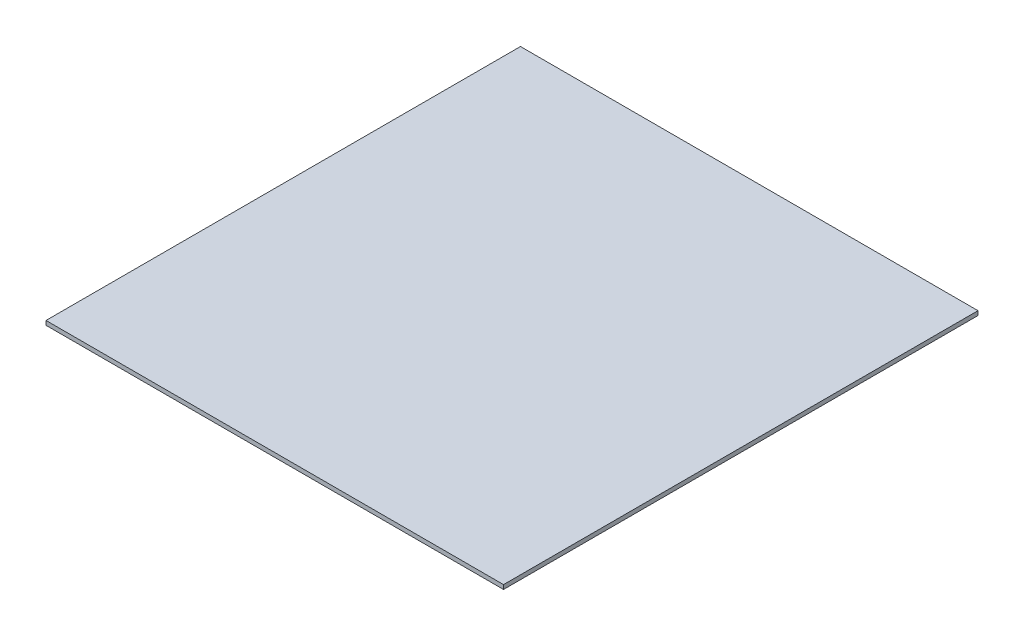
ISO-10303-21;
HEADER;
FILE_DESCRIPTION(('STEP AP214'),'2;1');
FILE_NAME('part.step','',(''),(''),'','','');
FILE_SCHEMA(('AUTOMOTIVE_DESIGN { 1 0 10303 214 1 1 1 1 }'));
ENDSEC;
DATA;
#1=APPLICATION_CONTEXT('core data for automotive mechanical design processes');
#2=APPLICATION_PROTOCOL_DEFINITION('international standard','automotive_design',2000,#1);
#3=PRODUCT_CONTEXT('',#1,'mechanical');
#4=PRODUCT('Part','Part','',(#3));
#5=PRODUCT_RELATED_PRODUCT_CATEGORY('part','',(#4));
#6=PRODUCT_DEFINITION_FORMATION('','',#4);
#7=PRODUCT_DEFINITION_CONTEXT('part definition',#1,'design');
#8=PRODUCT_DEFINITION('design','',#6,#7);
#9=PRODUCT_DEFINITION_SHAPE('','',#8);
#10=(LENGTH_UNIT() NAMED_UNIT(*) SI_UNIT(.MILLI.,.METRE.));
#11=(NAMED_UNIT(*) PLANE_ANGLE_UNIT() SI_UNIT($,.RADIAN.));
#12=(NAMED_UNIT(*) SI_UNIT($,.STERADIAN.) SOLID_ANGLE_UNIT());
#13=UNCERTAINTY_MEASURE_WITH_UNIT(LENGTH_MEASURE(1.E-05),#10,'distance_accuracy_value','');
#14=(GEOMETRIC_REPRESENTATION_CONTEXT(3) GLOBAL_UNCERTAINTY_ASSIGNED_CONTEXT((#13)) GLOBAL_UNIT_ASSIGNED_CONTEXT((#10,
#11,#12)) REPRESENTATION_CONTEXT('',''));
#15=CARTESIAN_POINT('',(0.,0.,0.));
#16=DIRECTION('',(0.,0.,1.));
#17=DIRECTION('',(1.,0.,0.));
#18=AXIS2_PLACEMENT_3D('',#15,#16,#17);
#19=CARTESIAN_POINT('',(0.,3.175,0.));
#20=DIRECTION('',(1.,0.,0.));
#21=DIRECTION('',(0.,0.,-1.));
#22=AXIS2_PLACEMENT_3D('',#19,#20,#21);
#23=PLANE('',#22);
#24=DIRECTION('',(0.,0.,1.));
#25=VECTOR('',#24,1.);
#26=CARTESIAN_POINT('',(0.,0.,0.));
#27=LINE('',#26,#25);
#28=CARTESIAN_POINT('',(0.,0.,-355.6));
#29=VERTEX_POINT('',#28);
#30=CARTESIAN_POINT('',(0.,0.,0.));
#31=VERTEX_POINT('',#30);
#32=EDGE_CURVE('E96',#29,#31,#27,.T.);
#33=ORIENTED_EDGE('',*,*,#32,.T.);
#34=DIRECTION('',(0.,-1.,0.));
#35=VECTOR('',#34,1.);
#36=CARTESIAN_POINT('',(0.,3.175,0.));
#37=LINE('',#36,#35);
#38=CARTESIAN_POINT('',(0.,3.175,0.));
#39=VERTEX_POINT('',#38);
#40=EDGE_CURVE('E11',#39,#31,#37,.T.);
#41=ORIENTED_EDGE('',*,*,#40,.F.);
#42=DIRECTION('',(0.,0.,1.));
#43=VECTOR('',#42,1.);
#44=CARTESIAN_POINT('',(0.,3.175,0.));
#45=LINE('',#44,#43);
#46=CARTESIAN_POINT('',(0.,3.175,-355.6));
#47=VERTEX_POINT('',#46);
#48=EDGE_CURVE('E84',#47,#39,#45,.T.);
#49=ORIENTED_EDGE('',*,*,#48,.F.);
#50=DIRECTION('',(0.,-1.,0.));
#51=VECTOR('',#50,1.);
#52=CARTESIAN_POINT('',(0.,3.175,-355.6));
#53=LINE('',#52,#51);
#54=EDGE_CURVE('E92',#47,#29,#53,.T.);
#55=ORIENTED_EDGE('',*,*,#54,.T.);
#56=EDGE_LOOP('',(#33,#41,#49,#55));
#57=FACE_BOUND('',#56,.T.);
#58=ADVANCED_FACE('F33',(#57),#23,.F.);
#59=CARTESIAN_POINT('',(0.,3.175,0.));
#60=DIRECTION('',(0.,0.,-1.));
#61=DIRECTION('',(-1.,0.,0.));
#62=AXIS2_PLACEMENT_3D('',#59,#60,#61);
#63=PLANE('',#62);
#64=DIRECTION('',(1.,0.,0.));
#65=VECTOR('',#64,1.);
#66=CARTESIAN_POINT('',(0.,0.,0.));
#67=LINE('',#66,#65);
#68=CARTESIAN_POINT('',(342.9,0.,0.));
#69=VERTEX_POINT('',#68);
#70=EDGE_CURVE('E88',#31,#69,#67,.T.);
#71=ORIENTED_EDGE('',*,*,#70,.T.);
#72=DIRECTION('',(0.,-1.,0.));
#73=VECTOR('',#72,1.);
#74=CARTESIAN_POINT('',(342.9,3.175,0.));
#75=LINE('',#74,#73);
#76=CARTESIAN_POINT('',(342.9,3.175,0.));
#77=VERTEX_POINT('',#76);
#78=EDGE_CURVE('E41',#77,#69,#75,.T.);
#79=ORIENTED_EDGE('',*,*,#78,.F.);
#80=DIRECTION('',(1.,0.,0.));
#81=VECTOR('',#80,1.);
#82=CARTESIAN_POINT('',(0.,3.175,0.));
#83=LINE('',#82,#81);
#84=EDGE_CURVE('E79',#39,#77,#83,.T.);
#85=ORIENTED_EDGE('',*,*,#84,.F.);
#86=ORIENTED_EDGE('',*,*,#40,.T.);
#87=EDGE_LOOP('',(#71,#79,#85,#86));
#88=FACE_BOUND('',#87,.T.);
#89=ADVANCED_FACE('F87',(#88),#63,.F.);
#90=CARTESIAN_POINT('',(342.9,3.175,0.));
#91=DIRECTION('',(-1.,0.,0.));
#92=DIRECTION('',(0.,0.,1.));
#93=AXIS2_PLACEMENT_3D('',#90,#91,#92);
#94=PLANE('',#93);
#95=DIRECTION('',(0.,0.,-1.));
#96=VECTOR('',#95,1.);
#97=CARTESIAN_POINT('',(342.9,0.,0.));
#98=LINE('',#97,#96);
#99=CARTESIAN_POINT('',(342.9,0.,-355.6));
#100=VERTEX_POINT('',#99);
#101=EDGE_CURVE('E66',#69,#100,#98,.T.);
#102=ORIENTED_EDGE('',*,*,#101,.T.);
#103=DIRECTION('',(0.,-1.,0.));
#104=VECTOR('',#103,1.);
#105=CARTESIAN_POINT('',(342.9,3.175,-355.6));
#106=LINE('',#105,#104);
#107=CARTESIAN_POINT('',(342.9,3.175,-355.6));
#108=VERTEX_POINT('',#107);
#109=EDGE_CURVE('E89',#108,#100,#106,.T.);
#110=ORIENTED_EDGE('',*,*,#109,.F.);
#111=DIRECTION('',(0.,0.,-1.));
#112=VECTOR('',#111,1.);
#113=CARTESIAN_POINT('',(342.9,3.175,0.));
#114=LINE('',#113,#112);
#115=EDGE_CURVE('E82',#77,#108,#114,.T.);
#116=ORIENTED_EDGE('',*,*,#115,.F.);
#117=ORIENTED_EDGE('',*,*,#78,.T.);
#118=EDGE_LOOP('',(#102,#110,#116,#117));
#119=FACE_BOUND('',#118,.T.);
#120=ADVANCED_FACE('F90',(#119),#94,.F.);
#121=CARTESIAN_POINT('',(0.,3.175,-355.6));
#122=DIRECTION('',(0.,0.,1.));
#123=DIRECTION('',(1.,0.,0.));
#124=AXIS2_PLACEMENT_3D('',#121,#122,#123);
#125=PLANE('',#124);
#126=DIRECTION('',(-1.,0.,0.));
#127=VECTOR('',#126,1.);
#128=CARTESIAN_POINT('',(0.,0.,-355.6));
#129=LINE('',#128,#127);
#130=EDGE_CURVE('E72',#100,#29,#129,.T.);
#131=ORIENTED_EDGE('',*,*,#130,.T.);
#132=ORIENTED_EDGE('',*,*,#54,.F.);
#133=DIRECTION('',(-1.,0.,0.));
#134=VECTOR('',#133,1.);
#135=CARTESIAN_POINT('',(0.,3.175,-355.6));
#136=LINE('',#135,#134);
#137=EDGE_CURVE('E49',#108,#47,#136,.T.);
#138=ORIENTED_EDGE('',*,*,#137,.F.);
#139=ORIENTED_EDGE('',*,*,#109,.T.);
#140=EDGE_LOOP('',(#131,#132,#138,#139));
#141=FACE_BOUND('',#140,.T.);
#142=ADVANCED_FACE('F103',(#141),#125,.F.);
#143=CARTESIAN_POINT('',(0.,3.175,0.));
#144=DIRECTION('',(0.,-1.,0.));
#145=DIRECTION('',(0.,0.,-1.));
#146=AXIS2_PLACEMENT_3D('',#143,#144,#145);
#147=PLANE('',#146);
#148=ORIENTED_EDGE('',*,*,#48,.T.);
#149=ORIENTED_EDGE('',*,*,#84,.T.);
#150=ORIENTED_EDGE('',*,*,#115,.T.);
#151=ORIENTED_EDGE('',*,*,#137,.T.);
#152=EDGE_LOOP('',(#148,#149,#150,#151));
#153=FACE_BOUND('',#152,.T.);
#154=ADVANCED_FACE('F80',(#153),#147,.F.);
#155=CARTESIAN_POINT('',(0.,0.,0.));
#156=DIRECTION('',(0.,-1.,0.));
#157=DIRECTION('',(0.,0.,-1.));
#158=AXIS2_PLACEMENT_3D('',#155,#156,#157);
#159=PLANE('',#158);
#160=ORIENTED_EDGE('',*,*,#32,.F.);
#161=ORIENTED_EDGE('',*,*,#130,.F.);
#162=ORIENTED_EDGE('',*,*,#101,.F.);
#163=ORIENTED_EDGE('',*,*,#70,.F.);
#164=EDGE_LOOP('',(#160,#161,#162,#163));
#165=FACE_BOUND('',#164,.T.);
#166=ADVANCED_FACE('F106',(#165),#159,.T.);
#167=CLOSED_SHELL('',(#58,#89,#120,#142,#154,#166));
#168=MANIFOLD_SOLID_BREP('B2',#167);
#169=ADVANCED_BREP_SHAPE_REPRESENTATION('',(#18,#168),#14);
#170=SHAPE_DEFINITION_REPRESENTATION(#9,#169);
ENDSEC;
END-ISO-10303-21;
